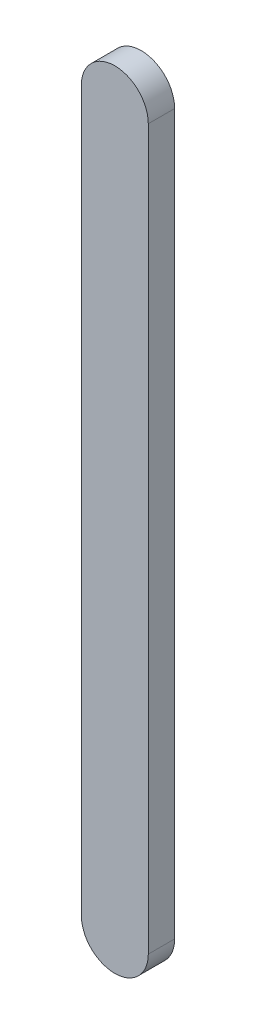
ISO-10303-21;
HEADER;
FILE_DESCRIPTION(('STEP AP214'),'2;1');
FILE_NAME('part.step','',(''),(''),'','','');
FILE_SCHEMA(('AUTOMOTIVE_DESIGN { 1 0 10303 214 1 1 1 1 }'));
ENDSEC;
DATA;
#1=APPLICATION_CONTEXT('core data for automotive mechanical design processes');
#2=APPLICATION_PROTOCOL_DEFINITION('international standard','automotive_design',2000,#1);
#3=PRODUCT_CONTEXT('',#1,'mechanical');
#4=PRODUCT('Part','Part','',(#3));
#5=PRODUCT_RELATED_PRODUCT_CATEGORY('part','',(#4));
#6=PRODUCT_DEFINITION_FORMATION('','',#4);
#7=PRODUCT_DEFINITION_CONTEXT('part definition',#1,'design');
#8=PRODUCT_DEFINITION('design','',#6,#7);
#9=PRODUCT_DEFINITION_SHAPE('','',#8);
#10=(LENGTH_UNIT() NAMED_UNIT(*) SI_UNIT(.MILLI.,.METRE.));
#11=(NAMED_UNIT(*) PLANE_ANGLE_UNIT() SI_UNIT($,.RADIAN.));
#12=(NAMED_UNIT(*) SI_UNIT($,.STERADIAN.) SOLID_ANGLE_UNIT());
#13=UNCERTAINTY_MEASURE_WITH_UNIT(LENGTH_MEASURE(1.E-05),#10,'distance_accuracy_value','');
#14=(GEOMETRIC_REPRESENTATION_CONTEXT(3) GLOBAL_UNCERTAINTY_ASSIGNED_CONTEXT((#13)) GLOBAL_UNIT_ASSIGNED_CONTEXT((#10,
#11,#12)) REPRESENTATION_CONTEXT('',''));
#15=CARTESIAN_POINT('',(0.,0.,0.));
#16=DIRECTION('',(0.,0.,1.));
#17=DIRECTION('',(1.,0.,0.));
#18=AXIS2_PLACEMENT_3D('',#15,#16,#17);
#19=CARTESIAN_POINT('',(150.5655104,68.8904896,0.));
#20=DIRECTION('',(-1.,0.,0.));
#21=DIRECTION('',(0.,1.,0.));
#22=AXIS2_PLACEMENT_3D('',#19,#20,#21);
#23=PLANE('',#22);
#24=DIRECTION('',(0.,1.,0.));
#25=VECTOR('',#24,1.);
#26=CARTESIAN_POINT('',(150.5655104,68.8904896,0.1999996));
#27=LINE('',#26,#25);
#28=CARTESIAN_POINT('',(150.5655104,68.8904896,0.1999996));
#29=VERTEX_POINT('',#28);
#30=CARTESIAN_POINT('',(150.5655104,74.3484924,0.1999996));
#31=VERTEX_POINT('',#30);
#32=EDGE_CURVE('E11',#29,#31,#27,.T.);
#33=ORIENTED_EDGE('',*,*,#32,.F.);
#34=DIRECTION('',(0.,0.,1.));
#35=VECTOR('',#34,1.);
#36=CARTESIAN_POINT('',(150.5655104,68.8904896,0.));
#37=LINE('',#36,#35);
#38=CARTESIAN_POINT('',(150.5655104,68.8904896,0.));
#39=VERTEX_POINT('',#38);
#40=EDGE_CURVE('E24',#39,#29,#37,.T.);
#41=ORIENTED_EDGE('',*,*,#40,.F.);
#42=DIRECTION('',(0.,1.,0.));
#43=VECTOR('',#42,1.);
#44=CARTESIAN_POINT('',(150.5655104,68.8904896,0.));
#45=LINE('',#44,#43);
#46=CARTESIAN_POINT('',(150.5655104,74.3484924,0.));
#47=VERTEX_POINT('',#46);
#48=EDGE_CURVE('E75',#39,#47,#45,.T.);
#49=ORIENTED_EDGE('',*,*,#48,.T.);
#50=DIRECTION('',(0.,0.,1.));
#51=VECTOR('',#50,1.);
#52=CARTESIAN_POINT('',(150.5655104,74.3484924,0.));
#53=LINE('',#52,#51);
#54=EDGE_CURVE('E37',#47,#31,#53,.T.);
#55=ORIENTED_EDGE('',*,*,#54,.T.);
#56=EDGE_LOOP('',(#33,#41,#49,#55));
#57=FACE_BOUND('',#56,.T.);
#58=ADVANCED_FACE('F17',(#57),#23,.F.);
#59=CARTESIAN_POINT('',(150.3115104,74.3484924,0.));
#60=DIRECTION('',(0.,0.,-1.));
#61=DIRECTION('',(1.,-1.11896493820492E-13,0.));
#62=AXIS2_PLACEMENT_3D('',#59,#60,#61);
#63=CYLINDRICAL_SURFACE('',#62,0.253999999999986);
#64=CARTESIAN_POINT('',(150.3115104,74.3484924,0.1999996));
#65=DIRECTION('',(0.,0.,1.));
#66=DIRECTION('',(1.,-1.11896493820492E-13,0.));
#67=AXIS2_PLACEMENT_3D('',#64,#65,#66);
#68=CIRCLE('',#67,0.253999999999986);
#69=CARTESIAN_POINT('',(150.0575104,74.3484924,0.1999996));
#70=VERTEX_POINT('',#69);
#71=EDGE_CURVE('E83',#31,#70,#68,.T.);
#72=ORIENTED_EDGE('',*,*,#71,.F.);
#73=ORIENTED_EDGE('',*,*,#54,.F.);
#74=CARTESIAN_POINT('',(150.3115104,74.3484924,0.));
#75=DIRECTION('',(0.,0.,1.));
#76=DIRECTION('',(1.,-1.11896493820492E-13,0.));
#77=AXIS2_PLACEMENT_3D('',#74,#75,#76);
#78=CIRCLE('',#77,0.253999999999986);
#79=CARTESIAN_POINT('',(150.0575104,74.3484924,0.));
#80=VERTEX_POINT('',#79);
#81=EDGE_CURVE('E81',#47,#80,#78,.T.);
#82=ORIENTED_EDGE('',*,*,#81,.T.);
#83=DIRECTION('',(0.,0.,1.));
#84=VECTOR('',#83,1.);
#85=CARTESIAN_POINT('',(150.0575104,74.3484924,0.));
#86=LINE('',#85,#84);
#87=EDGE_CURVE('E67',#80,#70,#86,.T.);
#88=ORIENTED_EDGE('',*,*,#87,.T.);
#89=EDGE_LOOP('',(#72,#73,#82,#88));
#90=FACE_BOUND('',#89,.T.);
#91=ADVANCED_FACE('F89',(#90),#63,.T.);
#92=CARTESIAN_POINT('',(150.0575104,74.3484924,0.));
#93=DIRECTION('',(1.,0.,0.));
#94=DIRECTION('',(0.,-1.,0.));
#95=AXIS2_PLACEMENT_3D('',#92,#93,#94);
#96=PLANE('',#95);
#97=DIRECTION('',(0.,-1.,0.));
#98=VECTOR('',#97,1.);
#99=CARTESIAN_POINT('',(150.0575104,74.3484924,0.1999996));
#100=LINE('',#99,#98);
#101=CARTESIAN_POINT('',(150.0575104,68.8904896,0.1999996));
#102=VERTEX_POINT('',#101);
#103=EDGE_CURVE('E71',#70,#102,#100,.T.);
#104=ORIENTED_EDGE('',*,*,#103,.F.);
#105=ORIENTED_EDGE('',*,*,#87,.F.);
#106=DIRECTION('',(0.,-1.,0.));
#107=VECTOR('',#106,1.);
#108=CARTESIAN_POINT('',(150.0575104,74.3484924,0.));
#109=LINE('',#108,#107);
#110=CARTESIAN_POINT('',(150.0575104,68.8904896,0.));
#111=VERTEX_POINT('',#110);
#112=EDGE_CURVE('E63',#80,#111,#109,.T.);
#113=ORIENTED_EDGE('',*,*,#112,.T.);
#114=DIRECTION('',(0.,0.,1.));
#115=VECTOR('',#114,1.);
#116=CARTESIAN_POINT('',(150.0575104,68.8904896,0.));
#117=LINE('',#116,#115);
#118=EDGE_CURVE('E53',#111,#102,#117,.T.);
#119=ORIENTED_EDGE('',*,*,#118,.T.);
#120=EDGE_LOOP('',(#104,#105,#113,#119));
#121=FACE_BOUND('',#120,.T.);
#122=ADVANCED_FACE('F66',(#121),#96,.F.);
#123=CARTESIAN_POINT('',(150.3115104,68.8904896,0.));
#124=DIRECTION('',(0.,0.,-1.));
#125=DIRECTION('',(-1.,1.11896493820492E-13,0.));
#126=AXIS2_PLACEMENT_3D('',#123,#124,#125);
#127=CYLINDRICAL_SURFACE('',#126,0.253999999999986);
#128=CARTESIAN_POINT('',(150.3115104,68.8904896,0.1999996));
#129=DIRECTION('',(0.,0.,1.));
#130=DIRECTION('',(-1.,1.11896493820492E-13,0.));
#131=AXIS2_PLACEMENT_3D('',#128,#129,#130);
#132=CIRCLE('',#131,0.253999999999986);
#133=EDGE_CURVE('E59',#102,#29,#132,.T.);
#134=ORIENTED_EDGE('',*,*,#133,.F.);
#135=ORIENTED_EDGE('',*,*,#118,.F.);
#136=CARTESIAN_POINT('',(150.3115104,68.8904896,0.));
#137=DIRECTION('',(0.,0.,1.));
#138=DIRECTION('',(-1.,1.11896493820492E-13,0.));
#139=AXIS2_PLACEMENT_3D('',#136,#137,#138);
#140=CIRCLE('',#139,0.253999999999986);
#141=EDGE_CURVE('E57',#111,#39,#140,.T.);
#142=ORIENTED_EDGE('',*,*,#141,.T.);
#143=ORIENTED_EDGE('',*,*,#40,.T.);
#144=EDGE_LOOP('',(#134,#135,#142,#143));
#145=FACE_BOUND('',#144,.T.);
#146=ADVANCED_FACE('F55',(#145),#127,.T.);
#147=CARTESIAN_POINT('',(150.5655104,68.8904896,0.));
#148=DIRECTION('',(0.,0.,-1.));
#149=DIRECTION('',(-1.,0.,0.));
#150=AXIS2_PLACEMENT_3D('',#147,#148,#149);
#151=PLANE('',#150);
#152=ORIENTED_EDGE('',*,*,#141,.F.);
#153=ORIENTED_EDGE('',*,*,#112,.F.);
#154=ORIENTED_EDGE('',*,*,#81,.F.);
#155=ORIENTED_EDGE('',*,*,#48,.F.);
#156=EDGE_LOOP('',(#152,#153,#154,#155));
#157=FACE_BOUND('',#156,.T.);
#158=ADVANCED_FACE('F74',(#157),#151,.T.);
#159=CARTESIAN_POINT('',(150.5655104,68.8904896,0.1999996));
#160=DIRECTION('',(0.,0.,-1.));
#161=DIRECTION('',(-1.,0.,0.));
#162=AXIS2_PLACEMENT_3D('',#159,#160,#161);
#163=PLANE('',#162);
#164=ORIENTED_EDGE('',*,*,#32,.T.);
#165=ORIENTED_EDGE('',*,*,#71,.T.);
#166=ORIENTED_EDGE('',*,*,#103,.T.);
#167=ORIENTED_EDGE('',*,*,#133,.T.);
#168=EDGE_LOOP('',(#164,#165,#166,#167));
#169=FACE_BOUND('',#168,.T.);
#170=ADVANCED_FACE('F91',(#169),#163,.F.);
#171=CLOSED_SHELL('',(#58,#91,#122,#146,#158,#170));
#172=MANIFOLD_SOLID_BREP('B1',#171);
#173=ADVANCED_BREP_SHAPE_REPRESENTATION('',(#18,#172),#14);
#174=SHAPE_DEFINITION_REPRESENTATION(#9,#173);
ENDSEC;
END-ISO-10303-21;
